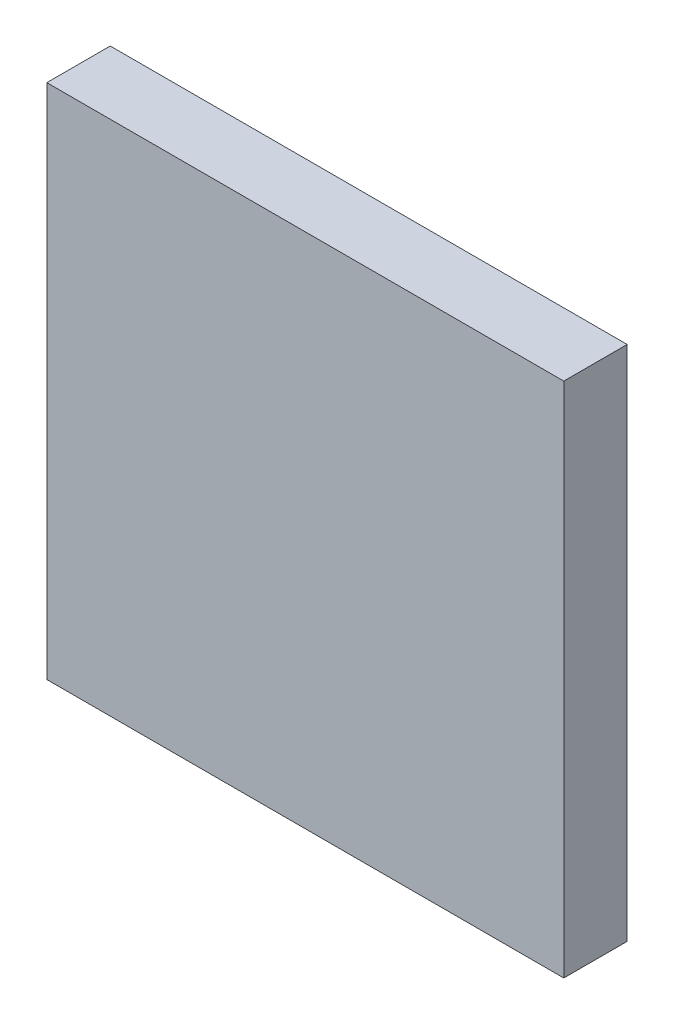
ISO-10303-21;
HEADER;
FILE_DESCRIPTION(('STEP AP214'),'2;1');
FILE_NAME('part.step','',(''),(''),'','','');
FILE_SCHEMA(('AUTOMOTIVE_DESIGN { 1 0 10303 214 1 1 1 1 }'));
ENDSEC;
DATA;
#1=APPLICATION_CONTEXT('core data for automotive mechanical design processes');
#2=APPLICATION_PROTOCOL_DEFINITION('international standard','automotive_design',2000,#1);
#3=PRODUCT_CONTEXT('',#1,'mechanical');
#4=PRODUCT('Part','Part','',(#3));
#5=PRODUCT_RELATED_PRODUCT_CATEGORY('part','',(#4));
#6=PRODUCT_DEFINITION_FORMATION('','',#4);
#7=PRODUCT_DEFINITION_CONTEXT('part definition',#1,'design');
#8=PRODUCT_DEFINITION('design','',#6,#7);
#9=PRODUCT_DEFINITION_SHAPE('','',#8);
#10=(LENGTH_UNIT() NAMED_UNIT(*) SI_UNIT(.MILLI.,.METRE.));
#11=(NAMED_UNIT(*) PLANE_ANGLE_UNIT() SI_UNIT($,.RADIAN.));
#12=(NAMED_UNIT(*) SI_UNIT($,.STERADIAN.) SOLID_ANGLE_UNIT());
#13=UNCERTAINTY_MEASURE_WITH_UNIT(LENGTH_MEASURE(1.E-05),#10,'distance_accuracy_value','');
#14=(GEOMETRIC_REPRESENTATION_CONTEXT(3) GLOBAL_UNCERTAINTY_ASSIGNED_CONTEXT((#13)) GLOBAL_UNIT_ASSIGNED_CONTEXT((#10,
#11,#12)) REPRESENTATION_CONTEXT('',''));
#15=CARTESIAN_POINT('',(0.,0.,0.));
#16=DIRECTION('',(0.,0.,1.));
#17=DIRECTION('',(1.,0.,0.));
#18=AXIS2_PLACEMENT_3D('',#15,#16,#17);
#19=CARTESIAN_POINT('',(17.9611613041247,8.50576052331409,-1.09999853576184));
#20=CARTESIAN_POINT('',(17.9611604491299,-1.27423947668585,-1.09999939075618));
#21=CARTESIAN_POINT('',(17.9611613041247,8.50576041840681,0.100001464238151));
#22=CARTESIAN_POINT('',(17.9611604491299,-1.27423958159313,0.100000609243813));
#23=(BOUNDED_SURFACE() B_SPLINE_SURFACE(1,1,((#19,#20),(#21,#22)),.UNSPECIFIED.,.F.,.F.,
.F.) B_SPLINE_SURFACE_WITH_KNOTS((2,2),(2,2),(-0.0001,0.0011),(-0.008965,0.000815),
.UNSPECIFIED.) GEOMETRIC_REPRESENTATION_ITEM() RATIONAL_B_SPLINE_SURFACE(((1.,1.),(1.,1.))) REPRESENTATION_ITEM('') SURFACE());
#24=CARTESIAN_POINT('',(17.9611605203795,-0.459239485428128,-0.999999319506653));
#25=CARTESIAN_POINT('',(17.9611612328751,7.69076051457182,-0.999998607011371));
#26=(BOUNDED_CURVE() B_SPLINE_CURVE(1,(#24,#25),.UNSPECIFIED.,.F.,
.F.) B_SPLINE_CURVE_WITH_KNOTS((2,2),(0.,0.00815),
.UNSPECIFIED.) CURVE() GEOMETRIC_REPRESENTATION_ITEM() RATIONAL_B_SPLINE_CURVE((1.,1.)) REPRESENTATION_ITEM(''));
#27=CARTESIAN_POINT('',(17.9611605203795,-0.459239485428128,-0.999999319506653));
#28=VERTEX_POINT('',#27);
#29=CARTESIAN_POINT('',(17.9611612328751,7.69076051457182,-0.999998607011371));
#30=VERTEX_POINT('',#29);
#31=EDGE_CURVE('E145',#28,#30,#26,.T.);
#32=CARTESIAN_POINT('',(17.9611612328751,7.69076042714909,1.39298862332146E-06));
#33=CARTESIAN_POINT('',(17.9611612328751,7.69076051457182,-0.999998607011371));
#34=(BOUNDED_CURVE() B_SPLINE_CURVE(1,(#32,#33),.UNSPECIFIED.,.F.,
.F.) B_SPLINE_CURVE_WITH_KNOTS((2,2),(0.,0.001),
.UNSPECIFIED.) CURVE() GEOMETRIC_REPRESENTATION_ITEM() RATIONAL_B_SPLINE_CURVE((1.,1.)) REPRESENTATION_ITEM(''));
#35=CARTESIAN_POINT('',(17.9611612328751,7.69076042714909,1.39298862332146E-06));
#36=VERTEX_POINT('',#35);
#37=EDGE_CURVE('E166',#36,#30,#34,.T.);
#38=CARTESIAN_POINT('',(17.9611605203795,-0.459239572850864,6.804933417974E-07));
#39=CARTESIAN_POINT('',(17.9611612328751,7.69076042714909,1.3929886234158E-06));
#40=(BOUNDED_CURVE() B_SPLINE_CURVE(1,(#38,#39),.UNSPECIFIED.,.F.,
.F.) B_SPLINE_CURVE_WITH_KNOTS((2,2),(0.,0.00815),
.UNSPECIFIED.) CURVE() GEOMETRIC_REPRESENTATION_ITEM() RATIONAL_B_SPLINE_CURVE((1.,1.)) REPRESENTATION_ITEM(''));
#41=CARTESIAN_POINT('',(17.9611605203795,-0.459239572850864,6.804933417974E-07));
#42=VERTEX_POINT('',#41);
#43=EDGE_CURVE('E159',#42,#36,#40,.T.);
#44=CARTESIAN_POINT('',(17.9611605203795,-0.459239572850864,6.804933417974E-07));
#45=CARTESIAN_POINT('',(17.9611605203795,-0.45923948542813,-0.999999319506653));
#46=(BOUNDED_CURVE() B_SPLINE_CURVE(1,(#44,#45),.UNSPECIFIED.,.F.,
.F.) B_SPLINE_CURVE_WITH_KNOTS((2,2),(0.,0.001),
.UNSPECIFIED.) CURVE() GEOMETRIC_REPRESENTATION_ITEM() RATIONAL_B_SPLINE_CURVE((1.,1.)) REPRESENTATION_ITEM(''));
#47=EDGE_CURVE('E11',#42,#28,#46,.T.);
#48=ORIENTED_EDGE('',*,*,#31,.T.);
#49=ORIENTED_EDGE('',*,*,#37,.F.);
#50=ORIENTED_EDGE('',*,*,#43,.F.);
#51=ORIENTED_EDGE('',*,*,#47,.T.);
#52=EDGE_LOOP('',(#48,#49,#50,#51));
#53=FACE_BOUND('',#52,.T.);
#54=ADVANCED_FACE('F17',(#53),#23,.T.);
#55=CARTESIAN_POINT('',(18.7761605203795,-0.45923954793542,-1.09999931950666));
#56=CARTESIAN_POINT('',(8.9961605203795,-0.459238692940665,-1.09999931950658));
#57=CARTESIAN_POINT('',(18.7761605203795,-0.4592396528427,0.100000680493335));
#58=CARTESIAN_POINT('',(8.9961605203795,-0.459238797847945,0.10000068049341));
#59=(BOUNDED_SURFACE() B_SPLINE_SURFACE(1,1,((#55,#56),(#57,#58)),.UNSPECIFIED.,.F.,.F.,
.F.) B_SPLINE_SURFACE_WITH_KNOTS((2,2),(2,2),(-0.0001,0.0011),(-0.000815,0.008965),
.UNSPECIFIED.) GEOMETRIC_REPRESENTATION_ITEM() RATIONAL_B_SPLINE_SURFACE(((1.,1.),(1.,1.))) REPRESENTATION_ITEM('') SURFACE());
#60=CARTESIAN_POINT('',(9.8111605203795,-0.459238860355232,6.80493404247445E-07));
#61=CARTESIAN_POINT('',(9.8111605203795,-0.459238772932498,-0.999999319506591));
#62=(BOUNDED_CURVE() B_SPLINE_CURVE(1,(#60,#61),.UNSPECIFIED.,.F.,
.F.) B_SPLINE_CURVE_WITH_KNOTS((2,2),(0.,0.001),
.UNSPECIFIED.) CURVE() GEOMETRIC_REPRESENTATION_ITEM() RATIONAL_B_SPLINE_CURVE((1.,1.)) REPRESENTATION_ITEM(''));
#63=CARTESIAN_POINT('',(9.8111605203795,-0.459238860355232,6.80493404247445E-07));
#64=VERTEX_POINT('',#63);
#65=CARTESIAN_POINT('',(9.8111605203795,-0.459238772932497,-0.999999319506591));
#66=VERTEX_POINT('',#65);
#67=EDGE_CURVE('E93',#64,#66,#62,.T.);
#68=CARTESIAN_POINT('',(17.9611605203795,-0.459239485428128,-0.999999319506653));
#69=CARTESIAN_POINT('',(9.8111605203795,-0.459238772932499,-0.999999319506591));
#70=(BOUNDED_CURVE() B_SPLINE_CURVE(1,(#68,#69),.UNSPECIFIED.,.F.,
.F.) B_SPLINE_CURVE_WITH_KNOTS((2,2),(0.,0.00815),
.UNSPECIFIED.) CURVE() GEOMETRIC_REPRESENTATION_ITEM() RATIONAL_B_SPLINE_CURVE((1.,1.)) REPRESENTATION_ITEM(''));
#71=EDGE_CURVE('E32',#28,#66,#70,.T.);
#72=CARTESIAN_POINT('',(17.9611605203795,-0.459239572850864,6.804933417974E-07));
#73=CARTESIAN_POINT('',(9.8111605203795,-0.459238860355235,6.80493404085718E-07));
#74=(BOUNDED_CURVE() B_SPLINE_CURVE(1,(#72,#73),.UNSPECIFIED.,.F.,
.F.) B_SPLINE_CURVE_WITH_KNOTS((2,2),(0.,0.00815),
.UNSPECIFIED.) CURVE() GEOMETRIC_REPRESENTATION_ITEM() RATIONAL_B_SPLINE_CURVE((1.,1.)) REPRESENTATION_ITEM(''));
#75=EDGE_CURVE('E126',#42,#64,#74,.T.);
#76=ORIENTED_EDGE('',*,*,#67,.T.);
#77=ORIENTED_EDGE('',*,*,#71,.F.);
#78=ORIENTED_EDGE('',*,*,#47,.F.);
#79=ORIENTED_EDGE('',*,*,#75,.T.);
#80=EDGE_LOOP('',(#76,#77,#78,#79));
#81=FACE_BOUND('',#80,.T.);
#82=ADVANCED_FACE('F226',(#81),#59,.T.);
#83=CARTESIAN_POINT('',(18.7761604491299,-1.27423955667769,-0.999999390756187));
#84=CARTESIAN_POINT('',(18.7761613041247,8.50576044332227,-0.999998535761849));
#85=CARTESIAN_POINT('',(8.99616044912994,-1.27423870168293,-0.999999390756113));
#86=CARTESIAN_POINT('',(8.99616130412469,8.50576129831703,-0.999998535761775));
#87=(BOUNDED_SURFACE() B_SPLINE_SURFACE(1,1,((#83,#84),(#85,#86)),.UNSPECIFIED.,.F.,.F.,
.F.) B_SPLINE_SURFACE_WITH_KNOTS((2,2),(2,2),(-0.000815,0.008965),(-0.000815,0.008965),
.UNSPECIFIED.) GEOMETRIC_REPRESENTATION_ITEM() RATIONAL_B_SPLINE_SURFACE(((1.,1.),(1.,1.))) REPRESENTATION_ITEM('') SURFACE());
#88=CARTESIAN_POINT('',(16.0934527807928,6.3324273445191,-0.999998725760571));
#89=CARTESIAN_POINT('',(16.0934528253238,6.8418023445191,-0.999998681229617));
#90=CARTESIAN_POINT('',(16.6028278253238,6.84180229998812,-0.99999868122962));
#91=CARTESIAN_POINT('',(17.1122028253238,6.84180225545714,-0.999998681229624));
#92=CARTESIAN_POINT('',(17.1122027807928,6.33242725545714,-0.999998725760579));
#93=(BOUNDED_CURVE() B_SPLINE_CURVE(2,(#88,#89,#90,#91,#92),.UNSPECIFIED.,.F.,
.F.) B_SPLINE_CURVE_WITH_KNOTS((3,2,3),(0.,1.5707963267949,3.14159265358981),
.UNSPECIFIED.) CURVE() GEOMETRIC_REPRESENTATION_ITEM() RATIONAL_B_SPLINE_CURVE((1.,
0.707106781186547,1.,0.707106781186534,1.)) REPRESENTATION_ITEM(''));
#94=CARTESIAN_POINT('',(16.0934527807928,6.3324273445191,-0.999998725760571));
#95=VERTEX_POINT('',#94);
#96=CARTESIAN_POINT('',(17.1122027807928,6.33242725545714,-0.999998725760579));
#97=VERTEX_POINT('',#96);
#98=EDGE_CURVE('E83',#95,#97,#93,.T.);
#99=CARTESIAN_POINT('',(17.1122027807928,6.33242725545714,-0.999998725760579));
#100=CARTESIAN_POINT('',(17.1122027362618,5.82305225545714,-0.999998770291534));
#101=CARTESIAN_POINT('',(16.6028277362618,5.82305229998812,-0.99999877029153));
#102=CARTESIAN_POINT('',(16.0934527362618,5.82305234451911,-0.999998770291526));
#103=CARTESIAN_POINT('',(16.0934527807928,6.3324273445191,-0.999998725760571));
#104=(BOUNDED_CURVE() B_SPLINE_CURVE(2,(#99,#100,#101,#102,#103),.UNSPECIFIED.,.F.,
.F.) B_SPLINE_CURVE_WITH_KNOTS((3,2,3),(3.14159265358981,4.7123889803847,6.28318530717959),
.UNSPECIFIED.) CURVE() GEOMETRIC_REPRESENTATION_ITEM() RATIONAL_B_SPLINE_CURVE((1.,
0.70710678118655,1.,0.70710678118655,1.)) REPRESENTATION_ITEM(''));
#105=EDGE_CURVE('E91',#97,#95,#104,.T.);
#106=CARTESIAN_POINT('',(9.8111605203795,-0.459238772932497,-0.999999319506591));
#107=CARTESIAN_POINT('',(9.81116123287513,7.69076122706747,-0.999998607011309));
#108=(BOUNDED_CURVE() B_SPLINE_CURVE(1,(#106,#107),.UNSPECIFIED.,.F.,
.F.) B_SPLINE_CURVE_WITH_KNOTS((2,2),(0.,0.00815),
.UNSPECIFIED.) CURVE() GEOMETRIC_REPRESENTATION_ITEM() RATIONAL_B_SPLINE_CURVE((1.,1.)) REPRESENTATION_ITEM(''));
#109=CARTESIAN_POINT('',(9.81116123287515,7.69076122706747,-0.999998607011309));
#110=VERTEX_POINT('',#109);
#111=EDGE_CURVE('E127',#66,#110,#108,.T.);
#112=CARTESIAN_POINT('',(17.9611612328751,7.69076051457182,-0.999998607011371));
#113=CARTESIAN_POINT('',(9.81116123287515,7.69076122706745,-0.999998607011309));
#114=(BOUNDED_CURVE() B_SPLINE_CURVE(1,(#112,#113),.UNSPECIFIED.,.F.,
.F.) B_SPLINE_CURVE_WITH_KNOTS((2,2),(0.,0.00815),
.UNSPECIFIED.) CURVE() GEOMETRIC_REPRESENTATION_ITEM() RATIONAL_B_SPLINE_CURVE((1.,1.)) REPRESENTATION_ITEM(''));
#115=EDGE_CURVE('E23',#30,#110,#114,.T.);
#116=ORIENTED_EDGE('',*,*,#98,.F.);
#117=ORIENTED_EDGE('',*,*,#105,.F.);
#118=EDGE_LOOP('',(#116,#117));
#119=FACE_BOUND('',#118,.T.);
#120=ORIENTED_EDGE('',*,*,#31,.F.);
#121=ORIENTED_EDGE('',*,*,#71,.T.);
#122=ORIENTED_EDGE('',*,*,#111,.T.);
#123=ORIENTED_EDGE('',*,*,#115,.F.);
#124=EDGE_LOOP('',(#120,#121,#122,#123));
#125=FACE_BOUND('',#124,.T.);
#126=ADVANCED_FACE('F95',(#119,#125),#87,.T.);
#127=CARTESIAN_POINT('',(18.7761612328751,7.69076034715725,0.100001392988617));
#128=CARTESIAN_POINT('',(8.99616123287515,7.69076120215201,0.100001392988691));
#129=CARTESIAN_POINT('',(18.7761612328751,7.69076045206453,-1.09999860701138));
#130=CARTESIAN_POINT('',(8.99616123287515,7.69076130705929,-1.0999986070113));
#131=(BOUNDED_SURFACE() B_SPLINE_SURFACE(1,1,((#127,#128),(#129,#130)),.UNSPECIFIED.,.F.,.F.,
.F.) B_SPLINE_SURFACE_WITH_KNOTS((2,2),(2,2),(-0.0001,0.0011),(-0.000815,0.008965),
.UNSPECIFIED.) GEOMETRIC_REPRESENTATION_ITEM() RATIONAL_B_SPLINE_SURFACE(((1.,1.),(1.,1.))) REPRESENTATION_ITEM('') SURFACE());
#132=CARTESIAN_POINT('',(17.9611612328751,7.69076042714909,1.39298862332146E-06));
#133=CARTESIAN_POINT('',(9.81116123287515,7.69076113964472,1.39298868560978E-06));
#134=(BOUNDED_CURVE() B_SPLINE_CURVE(1,(#132,#133),.UNSPECIFIED.,.F.,
.F.) B_SPLINE_CURVE_WITH_KNOTS((2,2),(0.,0.00815),
.UNSPECIFIED.) CURVE() GEOMETRIC_REPRESENTATION_ITEM() RATIONAL_B_SPLINE_CURVE((1.,1.)) REPRESENTATION_ITEM(''));
#135=CARTESIAN_POINT('',(9.81116123287515,7.69076113964473,1.39298868577151E-06));
#136=VERTEX_POINT('',#135);
#137=EDGE_CURVE('E72',#36,#136,#134,.T.);
#138=CARTESIAN_POINT('',(9.81116123287515,7.69076113964473,1.39298868577151E-06));
#139=CARTESIAN_POINT('',(9.81116123287515,7.69076122706746,-0.999998607011309));
#140=(BOUNDED_CURVE() B_SPLINE_CURVE(1,(#138,#139),.UNSPECIFIED.,.F.,
.F.) B_SPLINE_CURVE_WITH_KNOTS((2,2),(0.,0.001),
.UNSPECIFIED.) CURVE() GEOMETRIC_REPRESENTATION_ITEM() RATIONAL_B_SPLINE_CURVE((1.,1.)) REPRESENTATION_ITEM(''));
#141=EDGE_CURVE('E200',#136,#110,#140,.T.);
#142=ORIENTED_EDGE('',*,*,#137,.F.);
#143=ORIENTED_EDGE('',*,*,#37,.T.);
#144=ORIENTED_EDGE('',*,*,#115,.T.);
#145=ORIENTED_EDGE('',*,*,#141,.F.);
#146=EDGE_LOOP('',(#142,#143,#144,#145));
#147=FACE_BOUND('',#146,.T.);
#148=ADVANCED_FACE('F326',(#147),#131,.T.);
#149=CARTESIAN_POINT('',(8.99616044912994,-1.27423878910567,6.0924388215271E-07));
#150=CARTESIAN_POINT('',(8.99616130412469,8.50576121089429,1.4642382200948E-06));
#151=CARTESIAN_POINT('',(18.7761604491299,-1.27423964410042,6.09243807406727E-07));
#152=CARTESIAN_POINT('',(18.7761613041247,8.50576035589954,1.46423814534882E-06));
#153=(BOUNDED_SURFACE() B_SPLINE_SURFACE(1,1,((#149,#150),(#151,#152)),.UNSPECIFIED.,.F.,.F.,
.F.) B_SPLINE_SURFACE_WITH_KNOTS((2,2),(2,2),(-0.000815,0.008965),(-0.000815,0.008965),
.UNSPECIFIED.) GEOMETRIC_REPRESENTATION_ITEM() RATIONAL_B_SPLINE_SURFACE(((1.,1.),(1.,1.))) REPRESENTATION_ITEM('') SURFACE());
#154=CARTESIAN_POINT('',(9.8111605203795,-0.459238860355232,6.80493404247445E-07));
#155=CARTESIAN_POINT('',(9.81116123287513,7.69076113964473,1.39298868586585E-06));
#156=(BOUNDED_CURVE() B_SPLINE_CURVE(1,(#154,#155),.UNSPECIFIED.,.F.,
.F.) B_SPLINE_CURVE_WITH_KNOTS((2,2),(0.,0.00815),
.UNSPECIFIED.) CURVE() GEOMETRIC_REPRESENTATION_ITEM() RATIONAL_B_SPLINE_CURVE((1.,1.)) REPRESENTATION_ITEM(''));
#157=EDGE_CURVE('E192',#64,#136,#156,.T.);
#158=ORIENTED_EDGE('',*,*,#137,.T.);
#159=ORIENTED_EDGE('',*,*,#157,.F.);
#160=ORIENTED_EDGE('',*,*,#75,.F.);
#161=ORIENTED_EDGE('',*,*,#43,.T.);
#162=EDGE_LOOP('',(#158,#159,#160,#161));
#163=FACE_BOUND('',#162,.T.);
#164=ADVANCED_FACE('F19',(#163),#153,.T.);
#165=CARTESIAN_POINT('',(9.81116130412469,8.50576113090246,0.100001464238214));
#166=CARTESIAN_POINT('',(9.81116044912994,-1.2742388690975,0.100000609243876));
#167=CARTESIAN_POINT('',(9.81116130412469,8.50576123580974,-1.09999853576178));
#168=CARTESIAN_POINT('',(9.81116044912994,-1.27423876419022,-1.09999939075612));
#169=(BOUNDED_SURFACE() B_SPLINE_SURFACE(1,1,((#165,#166),(#167,#168)),.UNSPECIFIED.,.F.,.F.,
.F.) B_SPLINE_SURFACE_WITH_KNOTS((2,2),(2,2),(-0.0001,0.0011),(-0.008965,0.000815),
.UNSPECIFIED.) GEOMETRIC_REPRESENTATION_ITEM() RATIONAL_B_SPLINE_SURFACE(((1.,1.),(1.,1.))) REPRESENTATION_ITEM('') SURFACE());
#170=ORIENTED_EDGE('',*,*,#67,.F.);
#171=ORIENTED_EDGE('',*,*,#157,.T.);
#172=ORIENTED_EDGE('',*,*,#141,.T.);
#173=ORIENTED_EDGE('',*,*,#111,.F.);
#174=EDGE_LOOP('',(#170,#171,#172,#173));
#175=FACE_BOUND('',#174,.T.);
#176=ADVANCED_FACE('F224',(#175),#169,.T.);
#177=CARTESIAN_POINT('',(17.1122027807928,6.33242724671486,-0.899998725760579));
#178=CARTESIAN_POINT('',(17.1122027362618,5.82305224671487,-0.899998770291534));
#179=CARTESIAN_POINT('',(16.6028277362618,5.82305229124584,-0.89999877029153));
#180=CARTESIAN_POINT('',(16.0934527362618,5.82305233577682,-0.899998770291526));
#181=CARTESIAN_POINT('',(16.0934527807928,6.33242733577682,-0.899998725760571));
#182=CARTESIAN_POINT('',(16.0934528253238,6.84180233577682,-0.899998681229616));
#183=CARTESIAN_POINT('',(16.6028278253238,6.84180229124584,-0.89999868122962));
#184=CARTESIAN_POINT('',(17.1122028253238,6.84180224671486,-0.899998681229623));
#185=CARTESIAN_POINT('',(17.1122027807928,6.33242724671486,-0.899998725760579));
#186=CARTESIAN_POINT('',(17.1122027807928,6.33242725545714,-0.999998725760579));
#187=CARTESIAN_POINT('',(17.1122027362618,5.82305225545714,-0.999998770291534));
#188=CARTESIAN_POINT('',(16.6028277362618,5.82305229998812,-0.99999877029153));
#189=CARTESIAN_POINT('',(16.0934527362618,5.82305234451909,-0.999998770291526));
#190=CARTESIAN_POINT('',(16.0934527807928,6.33242734451909,-0.999998725760571));
#191=CARTESIAN_POINT('',(16.0934528253238,6.84180234451909,-0.999998681229617));
#192=CARTESIAN_POINT('',(16.6028278253238,6.84180229998811,-0.99999868122962));
#193=CARTESIAN_POINT('',(17.1122028253238,6.84180225545714,-0.999998681229624));
#194=CARTESIAN_POINT('',(17.1122027807928,6.33242725545714,-0.999998725760579));
#195=(BOUNDED_SURFACE() B_SPLINE_SURFACE(1,2,((#177,#178,#179,#180,#181,#182,#183,#184,#185),
(#186,#187,#188,#189,#190,#191,#192,#193,#194)),.UNSPECIFIED.,.F.,.T.,
.F.) B_SPLINE_SURFACE_WITH_KNOTS((2,2),(3,2,2,2,3),(0.,0.196319018404909),(-3.14159265358979,
-1.5707963267949,0.,1.5707963267949,3.14159265358979),
.UNSPECIFIED.) GEOMETRIC_REPRESENTATION_ITEM() RATIONAL_B_SPLINE_SURFACE(((1.,0.707106781186548,
1.,0.707106781186548,1.,0.707106781186548,1.,0.707106781186548,1.),(1.,0.707106781186548,1.,
0.707106781186548,1.,0.707106781186548,1.,0.707106781186548,1.))) REPRESENTATION_ITEM('') SURFACE());
#196=CARTESIAN_POINT('',(16.0934527807928,6.33242733577682,-0.899998725760571));
#197=CARTESIAN_POINT('',(16.0934528253238,6.84180233577681,-0.899998681229616));
#198=CARTESIAN_POINT('',(16.6028278253238,6.84180229124584,-0.89999868122962));
#199=CARTESIAN_POINT('',(17.1122028253238,6.84180224671486,-0.899998681229624));
#200=CARTESIAN_POINT('',(17.1122027807928,6.33242724671486,-0.899998725760579));
#201=(BOUNDED_CURVE() B_SPLINE_CURVE(2,(#196,#197,#198,#199,#200),.UNSPECIFIED.,.F.,
.F.) B_SPLINE_CURVE_WITH_KNOTS((3,2,3),(0.,1.5707963267949,3.14159265358979),
.UNSPECIFIED.) CURVE() GEOMETRIC_REPRESENTATION_ITEM() RATIONAL_B_SPLINE_CURVE((1.,
0.707106781186554,1.,0.707106781186541,1.)) REPRESENTATION_ITEM(''));
#202=CARTESIAN_POINT('',(16.0934527807928,6.33242733577682,-0.899998725760571));
#203=VERTEX_POINT('',#202);
#204=CARTESIAN_POINT('',(17.1122027807928,6.33242724671486,-0.899998725760579));
#205=VERTEX_POINT('',#204);
#206=EDGE_CURVE('E106',#203,#205,#201,.T.);
#207=CARTESIAN_POINT('',(17.1122027807928,6.33242724671486,-0.899998725760579));
#208=CARTESIAN_POINT('',(17.1122027362618,5.82305224671487,-0.899998770291534));
#209=CARTESIAN_POINT('',(16.6028277362618,5.82305229124584,-0.89999877029153));
#210=CARTESIAN_POINT('',(16.0934527362618,5.82305233577682,-0.899998770291526));
#211=CARTESIAN_POINT('',(16.0934527807928,6.33242733577682,-0.899998725760571));
#212=(BOUNDED_CURVE() B_SPLINE_CURVE(2,(#207,#208,#209,#210,#211),.UNSPECIFIED.,.F.,
.F.) B_SPLINE_CURVE_WITH_KNOTS((3,2,3),(3.14159265358979,4.71238898038469,6.28318530717959),
.UNSPECIFIED.) CURVE() GEOMETRIC_REPRESENTATION_ITEM() RATIONAL_B_SPLINE_CURVE((1.,
0.70710678118654,1.,0.707106781186538,1.)) REPRESENTATION_ITEM(''));
#213=EDGE_CURVE('E98',#205,#203,#212,.T.);
#214=CARTESIAN_POINT('',(17.1122027807928,6.33242724671486,-0.899998725760579));
#215=CARTESIAN_POINT('',(17.1122027807928,6.33242725545714,-0.999998725760579));
#216=(BOUNDED_CURVE() B_SPLINE_CURVE(1,(#214,#215),.UNSPECIFIED.,.F.,
.F.) B_SPLINE_CURVE_WITH_KNOTS((2,2),(0.,0.196319018404909),
.UNSPECIFIED.) CURVE() GEOMETRIC_REPRESENTATION_ITEM() RATIONAL_B_SPLINE_CURVE((1.,1.)) REPRESENTATION_ITEM(''));
#217=EDGE_CURVE('E89',#205,#97,#216,.T.);
#218=ORIENTED_EDGE('',*,*,#206,.F.);
#219=ORIENTED_EDGE('',*,*,#213,.F.);
#220=ORIENTED_EDGE('',*,*,#217,.T.);
#221=ORIENTED_EDGE('',*,*,#105,.T.);
#222=ORIENTED_EDGE('',*,*,#98,.T.);
#223=ORIENTED_EDGE('',*,*,#217,.F.);
#224=EDGE_LOOP('',(#218,#219,#220,#221,#222,#223));
#225=FACE_BOUND('',#224,.T.);
#226=ADVANCED_FACE('F87',(#225),#195,.T.);
#227=CARTESIAN_POINT('',(17.2140777273556,5.72117723780867,-0.899998779197726));
#228=CARTESIAN_POINT('',(17.21407783423,6.94367723780867,-0.899998672323434));
#229=CARTESIAN_POINT('',(15.9915777273556,5.72117734468301,-0.899998779197716));
#230=CARTESIAN_POINT('',(15.99157783423,6.94367734468301,-0.899998672323424));
#231=(BOUNDED_SURFACE() B_SPLINE_SURFACE(1,1,((#227,#228),(#229,#230)),.UNSPECIFIED.,.F.,.F.,
.F.) B_SPLINE_SURFACE_WITH_KNOTS((2,2),(2,2),(-0.00061125,0.00061125),(-0.00061125,0.00061125),
.UNSPECIFIED.) GEOMETRIC_REPRESENTATION_ITEM() RATIONAL_B_SPLINE_SURFACE(((1.,1.),(1.,1.))) REPRESENTATION_ITEM('') SURFACE());
#232=ORIENTED_EDGE('',*,*,#206,.T.);
#233=ORIENTED_EDGE('',*,*,#213,.T.);
#234=EDGE_LOOP('',(#232,#233));
#235=FACE_BOUND('',#234,.T.);
#236=ADVANCED_FACE('F306',(#235),#231,.T.);
#237=CLOSED_SHELL('',(#54,#82,#126,#148,#164,#176,#226,#236));
#238=MANIFOLD_SOLID_BREP('B1',#237);
#239=ADVANCED_BREP_SHAPE_REPRESENTATION('',(#18,#238),#14);
#240=SHAPE_DEFINITION_REPRESENTATION(#9,#239);
ENDSEC;
END-ISO-10303-21;
